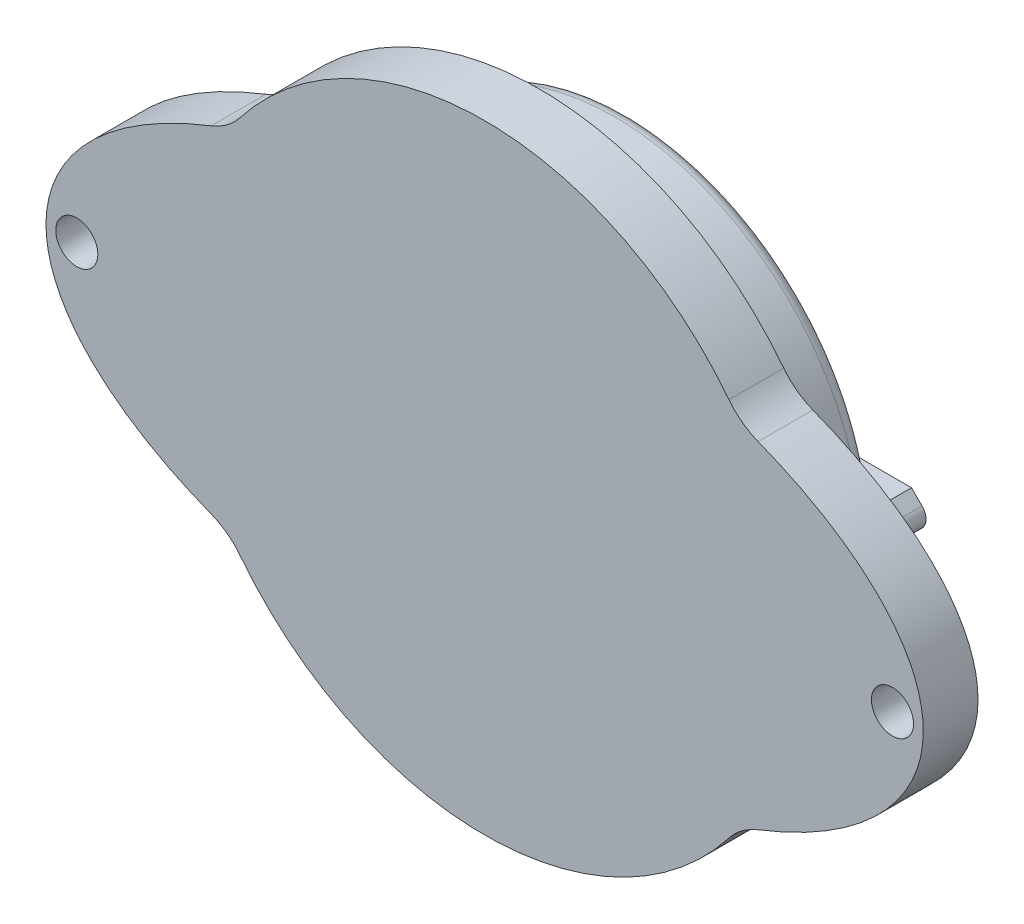
ISO-10303-21;
HEADER;
FILE_DESCRIPTION(('STEP AP214'),'2;1');
FILE_NAME('part.step','',(''),(''),'','','');
FILE_SCHEMA(('AUTOMOTIVE_DESIGN { 1 0 10303 214 1 1 1 1 }'));
ENDSEC;
DATA;
#1=APPLICATION_CONTEXT('core data for automotive mechanical design processes');
#2=APPLICATION_PROTOCOL_DEFINITION('international standard','automotive_design',2000,#1);
#3=PRODUCT_CONTEXT('',#1,'mechanical');
#4=PRODUCT('Part','Part','',(#3));
#5=PRODUCT_RELATED_PRODUCT_CATEGORY('part','',(#4));
#6=PRODUCT_DEFINITION_FORMATION('','',#4);
#7=PRODUCT_DEFINITION_CONTEXT('part definition',#1,'design');
#8=PRODUCT_DEFINITION('design','',#6,#7);
#9=PRODUCT_DEFINITION_SHAPE('','',#8);
#10=(LENGTH_UNIT() NAMED_UNIT(*) SI_UNIT(.MILLI.,.METRE.));
#11=(NAMED_UNIT(*) PLANE_ANGLE_UNIT() SI_UNIT($,.RADIAN.));
#12=(NAMED_UNIT(*) SI_UNIT($,.STERADIAN.) SOLID_ANGLE_UNIT());
#13=UNCERTAINTY_MEASURE_WITH_UNIT(LENGTH_MEASURE(1.E-05),#10,'distance_accuracy_value','');
#14=(GEOMETRIC_REPRESENTATION_CONTEXT(3) GLOBAL_UNCERTAINTY_ASSIGNED_CONTEXT((#13)) GLOBAL_UNIT_ASSIGNED_CONTEXT((#10,
#11,#12)) REPRESENTATION_CONTEXT('',''));
#15=CARTESIAN_POINT('',(0.,0.,0.));
#16=DIRECTION('',(0.,0.,1.));
#17=DIRECTION('',(1.,0.,0.));
#18=AXIS2_PLACEMENT_3D('',#15,#16,#17);
#19=CARTESIAN_POINT('',(0.,0.,-1.625));
#20=DIRECTION('',(0.,0.,-1.));
#21=DIRECTION('',(-1.,0.,0.));
#22=AXIS2_PLACEMENT_3D('',#19,#20,#21);
#23=PLANE('',#22);
#24=CARTESIAN_POINT('',(0.,0.,-1.625));
#25=DIRECTION('',(0.,0.,-1.));
#26=DIRECTION('',(-1.,0.,0.));
#27=AXIS2_PLACEMENT_3D('',#24,#25,#26);
#28=CIRCLE('',#27,1.07162769978083);
#29=CARTESIAN_POINT('',(1.00641753448666,-0.368116385420897,-1.625));
#30=VERTEX_POINT('',#29);
#31=CARTESIAN_POINT('',(-1.00641753448666,-0.368116385420897,-1.625));
#32=VERTEX_POINT('',#31);
#33=EDGE_CURVE('E58',#30,#32,#28,.T.);
#34=ORIENTED_EDGE('',*,*,#33,.F.);
#35=DIRECTION('',(-1.,0.,0.));
#36=VECTOR('',#35,1.);
#37=CARTESIAN_POINT('',(0.,-0.368116385420897,-1.625));
#38=LINE('',#37,#36);
#39=CARTESIAN_POINT('',(4.26000310000235,-0.368116385420897,-1.625));
#40=VERTEX_POINT('',#39);
#41=EDGE_CURVE('E349',#40,#30,#38,.T.);
#42=ORIENTED_EDGE('',*,*,#41,.F.);
#43=CARTESIAN_POINT('',(0.,0.,-1.625));
#44=DIRECTION('',(0.,0.,-1.));
#45=DIRECTION('',(-1.,0.,0.));
#46=AXIS2_PLACEMENT_3D('',#43,#44,#45);
#47=CIRCLE('',#46,4.27587839925845);
#48=CARTESIAN_POINT('',(-4.26000310000235,-0.368116385420897,-1.625));
#49=VERTEX_POINT('',#48);
#50=EDGE_CURVE('E343',#40,#49,#47,.T.);
#51=ORIENTED_EDGE('',*,*,#50,.T.);
#52=DIRECTION('',(-1.,0.,0.));
#53=VECTOR('',#52,1.);
#54=CARTESIAN_POINT('',(0.,-0.368116385420897,-1.625));
#55=LINE('',#54,#53);
#56=EDGE_CURVE('E63',#32,#49,#55,.T.);
#57=ORIENTED_EDGE('',*,*,#56,.F.);
#58=EDGE_LOOP('',(#34,#42,#51,#57));
#59=FACE_BOUND('',#58,.T.);
#60=ADVANCED_FACE('F43',(#59),#23,.T.);
#61=CARTESIAN_POINT('',(0.,0.,1.));
#62=DIRECTION('',(0.,0.,1.));
#63=DIRECTION('',(1.,0.,0.));
#64=AXIS2_PLACEMENT_3D('',#61,#62,#63);
#65=PLANE('',#64);
#66=CARTESIAN_POINT('',(-7.45231171374297,0.,1.));
#67=DIRECTION('',(0.,0.,1.));
#68=DIRECTION('',(1.,0.,0.));
#69=AXIS2_PLACEMENT_3D('',#66,#67,#68);
#70=CIRCLE('',#69,0.384477113661822);
#71=CARTESIAN_POINT('',(-7.06783460008115,0.,1.));
#72=VERTEX_POINT('',#71);
#73=EDGE_CURVE('E252',#72,#72,#70,.T.);
#74=ORIENTED_EDGE('',*,*,#73,.F.);
#75=EDGE_LOOP('',(#74));
#76=FACE_BOUND('',#75,.T.);
#77=CARTESIAN_POINT('',(0.,0.,1.));
#78=DIRECTION('',(0.,0.,1.));
#79=DIRECTION('',(1.,0.,0.));
#80=AXIS2_PLACEMENT_3D('',#77,#78,#79);
#81=ELLIPSE('',#80,8.01519842061445,3.92812840443711);
#82=CARTESIAN_POINT('',(4.99680595867471,-3.07136444133974,1.));
#83=VERTEX_POINT('',#82);
#84=CARTESIAN_POINT('',(4.99680595867472,3.07136444133974,1.));
#85=VERTEX_POINT('',#84);
#86=EDGE_CURVE('E258',#83,#85,#81,.T.);
#87=ORIENTED_EDGE('',*,*,#86,.T.);
#88=CARTESIAN_POINT('',(5.45174987300439,4.23563504339683,1.));
#89=DIRECTION('',(0.,0.,-1.));
#90=DIRECTION('',(-1.,0.,0.));
#91=AXIS2_PLACEMENT_3D('',#88,#89,#90);
#92=CIRCLE('',#91,1.25);
#93=CARTESIAN_POINT('',(4.46465480991579,3.46873000597295,1.));
#94=VERTEX_POINT('',#93);
#95=EDGE_CURVE('E262',#85,#94,#92,.T.);
#96=ORIENTED_EDGE('',*,*,#95,.T.);
#97=CARTESIAN_POINT('',(0.,0.,1.));
#98=DIRECTION('',(0.,0.,1.));
#99=DIRECTION('',(1.,0.,0.));
#100=AXIS2_PLACEMENT_3D('',#97,#98,#99);
#101=CIRCLE('',#100,5.65378018904532);
#102=CARTESIAN_POINT('',(-4.46465480991579,3.46873000597296,1.));
#103=VERTEX_POINT('',#102);
#104=EDGE_CURVE('E862',#94,#103,#101,.T.);
#105=ORIENTED_EDGE('',*,*,#104,.T.);
#106=CARTESIAN_POINT('',(-5.45174987300439,4.23563504339683,1.));
#107=DIRECTION('',(0.,0.,-1.));
#108=DIRECTION('',(-1.,0.,0.));
#109=AXIS2_PLACEMENT_3D('',#106,#107,#108);
#110=CIRCLE('',#109,1.25);
#111=CARTESIAN_POINT('',(-4.99680595867472,3.07136444133973,1.));
#112=VERTEX_POINT('',#111);
#113=EDGE_CURVE('E294',#103,#112,#110,.T.);
#114=ORIENTED_EDGE('',*,*,#113,.T.);
#115=CARTESIAN_POINT('',(0.,0.,1.));
#116=DIRECTION('',(0.,0.,1.));
#117=DIRECTION('',(1.,0.,0.));
#118=AXIS2_PLACEMENT_3D('',#115,#116,#117);
#119=ELLIPSE('',#118,8.01519842061445,3.92812840443711);
#120=CARTESIAN_POINT('',(-4.99680595867471,-3.07136444133974,1.));
#121=VERTEX_POINT('',#120);
#122=EDGE_CURVE('E289',#112,#121,#119,.T.);
#123=ORIENTED_EDGE('',*,*,#122,.T.);
#124=CARTESIAN_POINT('',(-5.45174987300439,-4.23563504339683,1.));
#125=DIRECTION('',(0.,0.,-1.));
#126=DIRECTION('',(1.,0.,0.));
#127=AXIS2_PLACEMENT_3D('',#124,#125,#126);
#128=CIRCLE('',#127,1.25);
#129=CARTESIAN_POINT('',(-4.46465480991579,-3.46873000597295,1.));
#130=VERTEX_POINT('',#129);
#131=EDGE_CURVE('E293',#121,#130,#128,.T.);
#132=ORIENTED_EDGE('',*,*,#131,.T.);
#133=CARTESIAN_POINT('',(0.,0.,1.));
#134=DIRECTION('',(0.,0.,1.));
#135=DIRECTION('',(1.,0.,0.));
#136=AXIS2_PLACEMENT_3D('',#133,#134,#135);
#137=CIRCLE('',#136,5.65378018904532);
#138=CARTESIAN_POINT('',(4.46465480991579,-3.46873000597296,1.));
#139=VERTEX_POINT('',#138);
#140=EDGE_CURVE('E296',#130,#139,#137,.T.);
#141=ORIENTED_EDGE('',*,*,#140,.T.);
#142=CARTESIAN_POINT('',(5.45174987300439,-4.23563504339683,1.));
#143=DIRECTION('',(0.,0.,-1.));
#144=DIRECTION('',(1.,0.,0.));
#145=AXIS2_PLACEMENT_3D('',#142,#143,#144);
#146=CIRCLE('',#145,1.25);
#147=EDGE_CURVE('E298',#139,#83,#146,.T.);
#148=ORIENTED_EDGE('',*,*,#147,.T.);
#149=EDGE_LOOP('',(#87,#96,#105,#114,#123,#132,#141,#148));
#150=FACE_BOUND('',#149,.T.);
#151=CARTESIAN_POINT('',(7.45231171374297,0.0245410923613923,1.));
#152=DIRECTION('',(0.,0.,1.));
#153=DIRECTION('',(1.,0.,0.));
#154=AXIS2_PLACEMENT_3D('',#151,#152,#153);
#155=CIRCLE('',#154,0.38447711366182);
#156=CARTESIAN_POINT('',(7.83678882740479,0.0245410923613923,1.));
#157=VERTEX_POINT('',#156);
#158=EDGE_CURVE('E246',#157,#157,#155,.T.);
#159=ORIENTED_EDGE('',*,*,#158,.F.);
#160=EDGE_LOOP('',(#159));
#161=FACE_BOUND('',#160,.T.);
#162=ADVANCED_FACE('F443',(#76,#150,#161),#65,.T.);
#163=CARTESIAN_POINT('',(0.,0.,0.));
#164=DIRECTION('',(0.,0.,1.));
#165=DIRECTION('',(1.,0.,0.));
#166=AXIS2_PLACEMENT_3D('',#163,#164,#165);
#167=PLANE('',#166);
#168=CARTESIAN_POINT('',(0.,0.,0.));
#169=DIRECTION('',(0.,0.,-1.));
#170=DIRECTION('',(-1.,0.,0.));
#171=AXIS2_PLACEMENT_3D('',#168,#169,#170);
#172=CIRCLE('',#171,5.17450547365865);
#173=CARTESIAN_POINT('',(-5.17450547365865,0.,0.));
#174=VERTEX_POINT('',#173);
#175=EDGE_CURVE('E237',#174,#174,#172,.T.);
#176=ORIENTED_EDGE('',*,*,#175,.F.);
#177=EDGE_LOOP('',(#176));
#178=FACE_BOUND('',#177,.T.);
#179=CARTESIAN_POINT('',(0.,0.,0.));
#180=DIRECTION('',(0.,0.,1.));
#181=DIRECTION('',(1.,0.,0.));
#182=AXIS2_PLACEMENT_3D('',#179,#180,#181);
#183=ELLIPSE('',#182,8.01519842061445,3.92812840443711);
#184=CARTESIAN_POINT('',(4.99680595867471,-3.07136444133974,0.));
#185=VERTEX_POINT('',#184);
#186=CARTESIAN_POINT('',(4.99680595867472,3.07136444133974,0.));
#187=VERTEX_POINT('',#186);
#188=EDGE_CURVE('E255',#185,#187,#183,.T.);
#189=ORIENTED_EDGE('',*,*,#188,.F.);
#190=CARTESIAN_POINT('',(5.45174987300439,-4.23563504339683,0.));
#191=DIRECTION('',(0.,0.,-1.));
#192=DIRECTION('',(1.,0.,0.));
#193=AXIS2_PLACEMENT_3D('',#190,#191,#192);
#194=CIRCLE('',#193,1.25);
#195=CARTESIAN_POINT('',(4.46465480991579,-3.46873000597296,0.));
#196=VERTEX_POINT('',#195);
#197=EDGE_CURVE('E263',#196,#185,#194,.T.);
#198=ORIENTED_EDGE('',*,*,#197,.F.);
#199=CARTESIAN_POINT('',(0.,0.,0.));
#200=DIRECTION('',(0.,0.,1.));
#201=DIRECTION('',(1.,0.,0.));
#202=AXIS2_PLACEMENT_3D('',#199,#200,#201);
#203=CIRCLE('',#202,5.65378018904532);
#204=CARTESIAN_POINT('',(-4.46465480991579,-3.46873000597295,0.));
#205=VERTEX_POINT('',#204);
#206=EDGE_CURVE('E313',#205,#196,#203,.T.);
#207=ORIENTED_EDGE('',*,*,#206,.F.);
#208=CARTESIAN_POINT('',(-5.45174987300439,-4.23563504339683,0.));
#209=DIRECTION('',(0.,0.,-1.));
#210=DIRECTION('',(1.,0.,0.));
#211=AXIS2_PLACEMENT_3D('',#208,#209,#210);
#212=CIRCLE('',#211,1.25);
#213=CARTESIAN_POINT('',(-4.99680595867471,-3.07136444133974,0.));
#214=VERTEX_POINT('',#213);
#215=EDGE_CURVE('E311',#214,#205,#212,.T.);
#216=ORIENTED_EDGE('',*,*,#215,.F.);
#217=CARTESIAN_POINT('',(0.,0.,0.));
#218=DIRECTION('',(0.,0.,1.));
#219=DIRECTION('',(1.,0.,0.));
#220=AXIS2_PLACEMENT_3D('',#217,#218,#219);
#221=ELLIPSE('',#220,8.01519842061445,3.92812840443711);
#222=CARTESIAN_POINT('',(-4.99680595867472,3.07136444133973,0.));
#223=VERTEX_POINT('',#222);
#224=EDGE_CURVE('E309',#223,#214,#221,.T.);
#225=ORIENTED_EDGE('',*,*,#224,.F.);
#226=CARTESIAN_POINT('',(-5.45174987300439,4.23563504339683,0.));
#227=DIRECTION('',(0.,0.,-1.));
#228=DIRECTION('',(-1.,0.,0.));
#229=AXIS2_PLACEMENT_3D('',#226,#227,#228);
#230=CIRCLE('',#229,1.25);
#231=CARTESIAN_POINT('',(-4.46465480991579,3.46873000597296,0.));
#232=VERTEX_POINT('',#231);
#233=EDGE_CURVE('E307',#232,#223,#230,.T.);
#234=ORIENTED_EDGE('',*,*,#233,.F.);
#235=CARTESIAN_POINT('',(0.,0.,0.));
#236=DIRECTION('',(0.,0.,1.));
#237=DIRECTION('',(1.,0.,0.));
#238=AXIS2_PLACEMENT_3D('',#235,#236,#237);
#239=CIRCLE('',#238,5.65378018904532);
#240=CARTESIAN_POINT('',(4.46465480991579,3.46873000597295,0.));
#241=VERTEX_POINT('',#240);
#242=EDGE_CURVE('E305',#241,#232,#239,.T.);
#243=ORIENTED_EDGE('',*,*,#242,.F.);
#244=CARTESIAN_POINT('',(5.45174987300439,4.23563504339683,0.));
#245=DIRECTION('',(0.,0.,-1.));
#246=DIRECTION('',(-1.,0.,0.));
#247=AXIS2_PLACEMENT_3D('',#244,#245,#246);
#248=CIRCLE('',#247,1.25);
#249=EDGE_CURVE('E303',#187,#241,#248,.T.);
#250=ORIENTED_EDGE('',*,*,#249,.F.);
#251=EDGE_LOOP('',(#189,#198,#207,#216,#225,#234,#243,#250));
#252=FACE_BOUND('',#251,.T.);
#253=CARTESIAN_POINT('',(-7.45231171374297,0.,0.));
#254=DIRECTION('',(0.,0.,1.));
#255=DIRECTION('',(1.,0.,0.));
#256=AXIS2_PLACEMENT_3D('',#253,#254,#255);
#257=CIRCLE('',#256,0.384477113661822);
#258=CARTESIAN_POINT('',(-7.06783460008115,0.,0.));
#259=VERTEX_POINT('',#258);
#260=EDGE_CURVE('E249',#259,#259,#257,.T.);
#261=ORIENTED_EDGE('',*,*,#260,.T.);
#262=EDGE_LOOP('',(#261));
#263=FACE_BOUND('',#262,.T.);
#264=CARTESIAN_POINT('',(7.45231171374297,0.0245410923613923,0.));
#265=DIRECTION('',(0.,0.,1.));
#266=DIRECTION('',(1.,0.,0.));
#267=AXIS2_PLACEMENT_3D('',#264,#265,#266);
#268=CIRCLE('',#267,0.38447711366182);
#269=CARTESIAN_POINT('',(7.83678882740479,0.0245410923613923,0.));
#270=VERTEX_POINT('',#269);
#271=EDGE_CURVE('E243',#270,#270,#268,.T.);
#272=ORIENTED_EDGE('',*,*,#271,.T.);
#273=EDGE_LOOP('',(#272));
#274=FACE_BOUND('',#273,.T.);
#275=ADVANCED_FACE('F269',(#178,#252,#263,#274),#167,.F.);
#276=DIRECTION('',(0.,0.,-1.));
#277=VECTOR('',#276,1.);
#278=SURFACE_OF_LINEAR_EXTRUSION('',#81,#277);
#279=ORIENTED_EDGE('',*,*,#188,.T.);
#280=DIRECTION('',(0.,0.,-1.));
#281=VECTOR('',#280,1.);
#282=CARTESIAN_POINT('',(4.99680595867472,3.07136444133974,1.));
#283=LINE('',#282,#281);
#284=EDGE_CURVE('E233',#85,#187,#283,.T.);
#285=ORIENTED_EDGE('',*,*,#284,.F.);
#286=ORIENTED_EDGE('',*,*,#86,.F.);
#287=DIRECTION('',(0.,0.,-1.));
#288=VECTOR('',#287,1.);
#289=CARTESIAN_POINT('',(4.99680595867471,-3.07136444133974,1.));
#290=LINE('',#289,#288);
#291=EDGE_CURVE('E300',#83,#185,#290,.T.);
#292=ORIENTED_EDGE('',*,*,#291,.T.);
#293=EDGE_LOOP('',(#279,#285,#286,#292));
#294=FACE_BOUND('',#293,.T.);
#295=ADVANCED_FACE('F265',(#294),#278,.F.);
#296=CARTESIAN_POINT('',(5.45174987300439,4.23563504339683,1.));
#297=DIRECTION('',(0.,0.,-1.));
#298=DIRECTION('',(-1.,0.,0.));
#299=AXIS2_PLACEMENT_3D('',#296,#297,#298);
#300=CYLINDRICAL_SURFACE('',#299,1.25);
#301=ORIENTED_EDGE('',*,*,#249,.T.);
#302=DIRECTION('',(0.,0.,-1.));
#303=VECTOR('',#302,1.);
#304=CARTESIAN_POINT('',(4.46465480991579,3.46873000597295,1.));
#305=LINE('',#304,#303);
#306=EDGE_CURVE('E333',#94,#241,#305,.T.);
#307=ORIENTED_EDGE('',*,*,#306,.F.);
#308=ORIENTED_EDGE('',*,*,#95,.F.);
#309=ORIENTED_EDGE('',*,*,#284,.T.);
#310=EDGE_LOOP('',(#301,#307,#308,#309));
#311=FACE_BOUND('',#310,.T.);
#312=ADVANCED_FACE('F268',(#311),#300,.F.);
#313=CARTESIAN_POINT('',(0.,0.,1.));
#314=DIRECTION('',(0.,0.,-1.));
#315=DIRECTION('',(-1.,0.,0.));
#316=AXIS2_PLACEMENT_3D('',#313,#314,#315);
#317=CYLINDRICAL_SURFACE('',#316,5.65378018904532);
#318=ORIENTED_EDGE('',*,*,#242,.T.);
#319=DIRECTION('',(0.,0.,-1.));
#320=VECTOR('',#319,1.);
#321=CARTESIAN_POINT('',(-4.46465480991579,3.46873000597296,1.));
#322=LINE('',#321,#320);
#323=EDGE_CURVE('E330',#103,#232,#322,.T.);
#324=ORIENTED_EDGE('',*,*,#323,.F.);
#325=ORIENTED_EDGE('',*,*,#104,.F.);
#326=ORIENTED_EDGE('',*,*,#306,.T.);
#327=EDGE_LOOP('',(#318,#324,#325,#326));
#328=FACE_BOUND('',#327,.T.);
#329=ADVANCED_FACE('F273',(#328),#317,.T.);
#330=CARTESIAN_POINT('',(-5.45174987300439,4.23563504339683,1.));
#331=DIRECTION('',(0.,0.,-1.));
#332=DIRECTION('',(-1.,0.,0.));
#333=AXIS2_PLACEMENT_3D('',#330,#331,#332);
#334=CYLINDRICAL_SURFACE('',#333,1.25);
#335=ORIENTED_EDGE('',*,*,#233,.T.);
#336=DIRECTION('',(0.,0.,-1.));
#337=VECTOR('',#336,1.);
#338=CARTESIAN_POINT('',(-4.99680595867472,3.07136444133973,1.));
#339=LINE('',#338,#337);
#340=EDGE_CURVE('E327',#112,#223,#339,.T.);
#341=ORIENTED_EDGE('',*,*,#340,.F.);
#342=ORIENTED_EDGE('',*,*,#113,.F.);
#343=ORIENTED_EDGE('',*,*,#323,.T.);
#344=EDGE_LOOP('',(#335,#341,#342,#343));
#345=FACE_BOUND('',#344,.T.);
#346=ADVANCED_FACE('F277',(#345),#334,.F.);
#347=DIRECTION('',(0.,0.,-1.));
#348=VECTOR('',#347,1.);
#349=SURFACE_OF_LINEAR_EXTRUSION('',#119,#348);
#350=ORIENTED_EDGE('',*,*,#224,.T.);
#351=DIRECTION('',(0.,0.,-1.));
#352=VECTOR('',#351,1.);
#353=CARTESIAN_POINT('',(-4.99680595867471,-3.07136444133974,1.));
#354=LINE('',#353,#352);
#355=EDGE_CURVE('E324',#121,#214,#354,.T.);
#356=ORIENTED_EDGE('',*,*,#355,.F.);
#357=ORIENTED_EDGE('',*,*,#122,.F.);
#358=ORIENTED_EDGE('',*,*,#340,.T.);
#359=EDGE_LOOP('',(#350,#356,#357,#358));
#360=FACE_BOUND('',#359,.T.);
#361=ADVANCED_FACE('F281',(#360),#349,.F.);
#362=CARTESIAN_POINT('',(-5.45174987300439,-4.23563504339683,1.));
#363=DIRECTION('',(0.,0.,-1.));
#364=DIRECTION('',(-1.,0.,0.));
#365=AXIS2_PLACEMENT_3D('',#362,#363,#364);
#366=CYLINDRICAL_SURFACE('',#365,1.25);
#367=ORIENTED_EDGE('',*,*,#215,.T.);
#368=DIRECTION('',(0.,0.,-1.));
#369=VECTOR('',#368,1.);
#370=CARTESIAN_POINT('',(-4.46465480991579,-3.46873000597295,1.));
#371=LINE('',#370,#369);
#372=EDGE_CURVE('E321',#130,#205,#371,.T.);
#373=ORIENTED_EDGE('',*,*,#372,.F.);
#374=ORIENTED_EDGE('',*,*,#131,.F.);
#375=ORIENTED_EDGE('',*,*,#355,.T.);
#376=EDGE_LOOP('',(#367,#373,#374,#375));
#377=FACE_BOUND('',#376,.T.);
#378=ADVANCED_FACE('F286',(#377),#366,.F.);
#379=CARTESIAN_POINT('',(0.,0.,1.));
#380=DIRECTION('',(0.,0.,-1.));
#381=DIRECTION('',(-1.,0.,0.));
#382=AXIS2_PLACEMENT_3D('',#379,#380,#381);
#383=CYLINDRICAL_SURFACE('',#382,5.65378018904532);
#384=ORIENTED_EDGE('',*,*,#206,.T.);
#385=DIRECTION('',(0.,0.,-1.));
#386=VECTOR('',#385,1.);
#387=CARTESIAN_POINT('',(4.46465480991579,-3.46873000597296,1.));
#388=LINE('',#387,#386);
#389=EDGE_CURVE('E318',#139,#196,#388,.T.);
#390=ORIENTED_EDGE('',*,*,#389,.F.);
#391=ORIENTED_EDGE('',*,*,#140,.F.);
#392=ORIENTED_EDGE('',*,*,#372,.T.);
#393=EDGE_LOOP('',(#384,#390,#391,#392));
#394=FACE_BOUND('',#393,.T.);
#395=ADVANCED_FACE('F692',(#394),#383,.T.);
#396=CARTESIAN_POINT('',(5.45174987300439,-4.23563504339683,1.));
#397=DIRECTION('',(0.,0.,-1.));
#398=DIRECTION('',(-1.,0.,0.));
#399=AXIS2_PLACEMENT_3D('',#396,#397,#398);
#400=CYLINDRICAL_SURFACE('',#399,1.25);
#401=ORIENTED_EDGE('',*,*,#197,.T.);
#402=ORIENTED_EDGE('',*,*,#291,.F.);
#403=ORIENTED_EDGE('',*,*,#147,.F.);
#404=ORIENTED_EDGE('',*,*,#389,.T.);
#405=EDGE_LOOP('',(#401,#402,#403,#404));
#406=FACE_BOUND('',#405,.T.);
#407=ADVANCED_FACE('F687',(#406),#400,.F.);
#408=CARTESIAN_POINT('',(-7.45231171374297,0.,1.));
#409=DIRECTION('',(0.,0.,-1.));
#410=DIRECTION('',(-1.,0.,0.));
#411=AXIS2_PLACEMENT_3D('',#408,#409,#410);
#412=CYLINDRICAL_SURFACE('',#411,0.384477113661822);
#413=ORIENTED_EDGE('',*,*,#73,.T.);
#414=EDGE_LOOP('',(#413));
#415=FACE_BOUND('',#414,.T.);
#416=ORIENTED_EDGE('',*,*,#260,.F.);
#417=EDGE_LOOP('',(#416));
#418=FACE_BOUND('',#417,.T.);
#419=ADVANCED_FACE('F691',(#415,#418),#412,.F.);
#420=CARTESIAN_POINT('',(7.45231171374297,0.0245410923613923,1.));
#421=DIRECTION('',(0.,0.,-1.));
#422=DIRECTION('',(-1.,0.,0.));
#423=AXIS2_PLACEMENT_3D('',#420,#421,#422);
#424=CYLINDRICAL_SURFACE('',#423,0.38447711366182);
#425=ORIENTED_EDGE('',*,*,#158,.T.);
#426=EDGE_LOOP('',(#425));
#427=FACE_BOUND('',#426,.T.);
#428=ORIENTED_EDGE('',*,*,#271,.F.);
#429=EDGE_LOOP('',(#428));
#430=FACE_BOUND('',#429,.T.);
#431=ADVANCED_FACE('F717',(#427,#430),#424,.F.);
#432=CARTESIAN_POINT('',(0.,0.,0.25));
#433=DIRECTION('',(0.,0.,-1.));
#434=DIRECTION('',(-1.,0.,0.));
#435=AXIS2_PLACEMENT_3D('',#432,#433,#434);
#436=CYLINDRICAL_SURFACE('',#435,5.17450547365865);
#437=CARTESIAN_POINT('',(0.,0.,0.25));
#438=DIRECTION('',(0.,0.,-1.));
#439=DIRECTION('',(-1.,0.,0.));
#440=AXIS2_PLACEMENT_3D('',#437,#438,#439);
#441=CIRCLE('',#440,5.17450547365865);
#442=CARTESIAN_POINT('',(-5.17450547365865,0.,0.25));
#443=VERTEX_POINT('',#442);
#444=EDGE_CURVE('E240',#443,#443,#441,.T.);
#445=ORIENTED_EDGE('',*,*,#444,.F.);
#446=EDGE_LOOP('',(#445));
#447=FACE_BOUND('',#446,.T.);
#448=ORIENTED_EDGE('',*,*,#175,.T.);
#449=EDGE_LOOP('',(#448));
#450=FACE_BOUND('',#449,.T.);
#451=ADVANCED_FACE('F721',(#447,#450),#436,.F.);
#452=CARTESIAN_POINT('',(0.,0.,0.25));
#453=DIRECTION('',(0.,0.,-1.));
#454=DIRECTION('',(-1.,0.,0.));
#455=AXIS2_PLACEMENT_3D('',#452,#453,#454);
#456=PLANE('',#455);
#457=CARTESIAN_POINT('',(0.,0.,0.25));
#458=DIRECTION('',(0.,0.,-1.));
#459=DIRECTION('',(-1.,0.,0.));
#460=AXIS2_PLACEMENT_3D('',#457,#458,#459);
#461=CIRCLE('',#460,5.025);
#462=CARTESIAN_POINT('',(-5.025,0.,0.25));
#463=VERTEX_POINT('',#462);
#464=EDGE_CURVE('E234',#463,#463,#461,.T.);
#465=ORIENTED_EDGE('',*,*,#464,.F.);
#466=EDGE_LOOP('',(#465));
#467=FACE_BOUND('',#466,.T.);
#468=ORIENTED_EDGE('',*,*,#444,.T.);
#469=EDGE_LOOP('',(#468));
#470=FACE_BOUND('',#469,.T.);
#471=ADVANCED_FACE('F736',(#467,#470),#456,.T.);
#472=CARTESIAN_POINT('',(0.,0.,0.25));
#473=DIRECTION('',(0.,0.,-1.));
#474=DIRECTION('',(-1.,0.,0.));
#475=AXIS2_PLACEMENT_3D('',#472,#473,#474);
#476=CYLINDRICAL_SURFACE('',#475,5.025);
#477=ORIENTED_EDGE('',*,*,#464,.T.);
#478=EDGE_LOOP('',(#477));
#479=FACE_BOUND('',#478,.T.);
#480=CARTESIAN_POINT('',(0.,0.,0.));
#481=DIRECTION('',(0.,0.,-1.));
#482=DIRECTION('',(-1.,0.,0.));
#483=AXIS2_PLACEMENT_3D('',#480,#481,#482);
#484=CIRCLE('',#483,5.025);
#485=CARTESIAN_POINT('',(-5.025,0.,0.));
#486=VERTEX_POINT('',#485);
#487=EDGE_CURVE('E228',#486,#486,#484,.T.);
#488=ORIENTED_EDGE('',*,*,#487,.F.);
#489=EDGE_LOOP('',(#488));
#490=FACE_BOUND('',#489,.T.);
#491=ADVANCED_FACE('F732',(#479,#490),#476,.T.);
#492=CARTESIAN_POINT('',(0.,0.,0.));
#493=DIRECTION('',(0.,0.,-1.));
#494=DIRECTION('',(-1.,0.,0.));
#495=AXIS2_PLACEMENT_3D('',#492,#493,#494);
#496=CIRCLE('',#495,3.23124382758339);
#497=CARTESIAN_POINT('',(-3.23124382758339,0.,0.));
#498=VERTEX_POINT('',#497);
#499=EDGE_CURVE('E229',#498,#498,#496,.T.);
#500=ORIENTED_EDGE('',*,*,#499,.F.);
#501=EDGE_LOOP('',(#500));
#502=FACE_BOUND('',#501,.T.);
#503=ORIENTED_EDGE('',*,*,#487,.T.);
#504=EDGE_LOOP('',(#503));
#505=FACE_BOUND('',#504,.T.);
#506=ADVANCED_FACE('F679',(#502,#505),#167,.F.);
#507=CARTESIAN_POINT('',(0.,0.,-0.125));
#508=DIRECTION('',(0.,0.,1.));
#509=DIRECTION('',(1.,0.,0.));
#510=AXIS2_PLACEMENT_3D('',#507,#508,#509);
#511=CYLINDRICAL_SURFACE('',#510,3.23124382758339);
#512=CARTESIAN_POINT('',(0.,0.,-0.125));
#513=DIRECTION('',(0.,0.,-1.));
#514=DIRECTION('',(-1.,0.,0.));
#515=AXIS2_PLACEMENT_3D('',#512,#513,#514);
#516=CIRCLE('',#515,3.23124382758339);
#517=CARTESIAN_POINT('',(-3.23124382758339,0.,-0.125));
#518=VERTEX_POINT('',#517);
#519=EDGE_CURVE('E220',#518,#518,#516,.T.);
#520=ORIENTED_EDGE('',*,*,#519,.F.);
#521=EDGE_LOOP('',(#520));
#522=FACE_BOUND('',#521,.T.);
#523=ORIENTED_EDGE('',*,*,#499,.T.);
#524=EDGE_LOOP('',(#523));
#525=FACE_BOUND('',#524,.T.);
#526=ADVANCED_FACE('F462',(#522,#525),#511,.T.);
#527=CARTESIAN_POINT('',(0.,0.,-1.625));
#528=DIRECTION('',(0.,0.,1.));
#529=DIRECTION('',(1.,0.,0.));
#530=AXIS2_PLACEMENT_3D('',#527,#528,#529);
#531=CYLINDRICAL_SURFACE('',#530,4.52587839925845);
#532=CARTESIAN_POINT('',(0.,0.,-1.375));
#533=DIRECTION('',(0.,0.,-1.));
#534=DIRECTION('',(-1.,0.,0.));
#535=AXIS2_PLACEMENT_3D('',#532,#533,#534);
#536=CIRCLE('',#535,4.52587839925845);
#537=CARTESIAN_POINT('',(-4.52587839925845,0.,-1.375));
#538=VERTEX_POINT('',#537);
#539=EDGE_CURVE('E11',#538,#538,#536,.F.);
#540=ORIENTED_EDGE('',*,*,#539,.T.);
#541=EDGE_LOOP('',(#540));
#542=FACE_BOUND('',#541,.T.);
#543=CARTESIAN_POINT('',(0.,0.,-0.125));
#544=DIRECTION('',(0.,0.,-1.));
#545=DIRECTION('',(-1.,0.,0.));
#546=AXIS2_PLACEMENT_3D('',#543,#544,#545);
#547=CIRCLE('',#546,4.52587839925845);
#548=CARTESIAN_POINT('',(-4.52587839925845,0.,-0.125));
#549=VERTEX_POINT('',#548);
#550=EDGE_CURVE('E217',#549,#549,#547,.T.);
#551=ORIENTED_EDGE('',*,*,#550,.T.);
#552=EDGE_LOOP('',(#551));
#553=FACE_BOUND('',#552,.T.);
#554=ADVANCED_FACE('F456',(#542,#553),#531,.T.);
#555=DIRECTION('',(-1.,0.,0.));
#556=VECTOR('',#555,1.);
#557=CARTESIAN_POINT('',(0.,0.368116385420897,-1.625));
#558=LINE('',#557,#556);
#559=CARTESIAN_POINT('',(-1.00641753448666,0.368116385420897,-1.625));
#560=VERTEX_POINT('',#559);
#561=CARTESIAN_POINT('',(-4.26000310000235,0.368116385420897,-1.625));
#562=VERTEX_POINT('',#561);
#563=EDGE_CURVE('E376',#560,#562,#558,.T.);
#564=ORIENTED_EDGE('',*,*,#563,.T.);
#565=CARTESIAN_POINT('',(4.26000310000235,0.368116385420897,-1.625));
#566=VERTEX_POINT('',#565);
#567=EDGE_CURVE('E51',#562,#566,#47,.T.);
#568=ORIENTED_EDGE('',*,*,#567,.T.);
#569=CARTESIAN_POINT('',(1.00641753448666,0.368116385420897,-1.625));
#570=VERTEX_POINT('',#569);
#571=EDGE_CURVE('E382',#566,#570,#558,.T.);
#572=ORIENTED_EDGE('',*,*,#571,.T.);
#573=CARTESIAN_POINT('',(0.,0.,-1.625));
#574=DIRECTION('',(0.,0.,-1.));
#575=DIRECTION('',(-1.,0.,0.));
#576=AXIS2_PLACEMENT_3D('',#573,#574,#575);
#577=CIRCLE('',#576,1.07162769978083);
#578=EDGE_CURVE('E378',#560,#570,#577,.T.);
#579=ORIENTED_EDGE('',*,*,#578,.F.);
#580=EDGE_LOOP('',(#564,#568,#572,#579));
#581=FACE_BOUND('',#580,.T.);
#582=ADVANCED_FACE('F445',(#581),#23,.T.);
#583=CARTESIAN_POINT('',(0.,0.,-0.125));
#584=DIRECTION('',(0.,0.,-1.));
#585=DIRECTION('',(-1.,0.,0.));
#586=AXIS2_PLACEMENT_3D('',#583,#584,#585);
#587=PLANE('',#586);
#588=ORIENTED_EDGE('',*,*,#519,.T.);
#589=EDGE_LOOP('',(#588));
#590=FACE_BOUND('',#589,.T.);
#591=ORIENTED_EDGE('',*,*,#550,.F.);
#592=EDGE_LOOP('',(#591));
#593=FACE_BOUND('',#592,.T.);
#594=ADVANCED_FACE('F455',(#590,#593),#587,.F.);
#595=CARTESIAN_POINT('',(0.,0.,-1.375));
#596=DIRECTION('',(0.,0.,-1.));
#597=DIRECTION('',(-1.,0.,0.));
#598=AXIS2_PLACEMENT_3D('',#595,#596,#597);
#599=TOROIDAL_SURFACE('',#598,4.27587839925845,0.25);
#600=ORIENTED_EDGE('',*,*,#539,.F.);
#601=EDGE_LOOP('',(#600));
#602=FACE_BOUND('',#601,.T.);
#603=ORIENTED_EDGE('',*,*,#567,.F.);
#604=EDGE_CURVE('E232',#49,#562,#47,.T.);
#605=ORIENTED_EDGE('',*,*,#604,.F.);
#606=ORIENTED_EDGE('',*,*,#50,.F.);
#607=EDGE_CURVE('E338',#566,#40,#47,.T.);
#608=ORIENTED_EDGE('',*,*,#607,.F.);
#609=EDGE_LOOP('',(#603,#605,#606,#608));
#610=FACE_BOUND('',#609,.T.);
#611=ADVANCED_FACE('F45',(#602,#610),#599,.T.);
#612=CARTESIAN_POINT('',(0.,0.,-1.625));
#613=DIRECTION('',(0.,0.,-1.));
#614=DIRECTION('',(-1.,0.,0.));
#615=AXIS2_PLACEMENT_3D('',#612,#613,#614);
#616=PLANE('',#615);
#617=ORIENTED_EDGE('',*,*,#607,.T.);
#618=CARTESIAN_POINT('',(4.42557698917118,-0.368116385420897,-1.625));
#619=VERTEX_POINT('',#618);
#620=EDGE_CURVE('E431',#619,#40,#38,.T.);
#621=ORIENTED_EDGE('',*,*,#620,.F.);
#622=DIRECTION('',(-0.707106781186548,-0.707106781186547,0.));
#623=VECTOR('',#622,1.);
#624=CARTESIAN_POINT('',(2.39684668729604,-2.39684668729604,-1.625));
#625=LINE('',#624,#623);
#626=CARTESIAN_POINT('',(4.61691667929544,-0.176776695296638,-1.625));
#627=VERTEX_POINT('',#626);
#628=EDGE_CURVE('E216',#627,#619,#625,.T.);
#629=ORIENTED_EDGE('',*,*,#628,.F.);
#630=CARTESIAN_POINT('',(4.4401399839988,0.,-1.625));
#631=DIRECTION('',(0.,0.,-1.));
#632=DIRECTION('',(-1.,0.,0.));
#633=AXIS2_PLACEMENT_3D('',#630,#631,#632);
#634=CIRCLE('',#633,0.25);
#635=CARTESIAN_POINT('',(4.61691667929544,0.176776695296638,-1.625));
#636=VERTEX_POINT('',#635);
#637=EDGE_CURVE('E212',#636,#627,#634,.T.);
#638=ORIENTED_EDGE('',*,*,#637,.F.);
#639=DIRECTION('',(0.707106781186548,-0.707106781186547,0.));
#640=VECTOR('',#639,1.);
#641=CARTESIAN_POINT('',(2.39684668729604,2.39684668729604,-1.625));
#642=LINE('',#641,#640);
#643=CARTESIAN_POINT('',(4.42557698917118,0.368116385420897,-1.625));
#644=VERTEX_POINT('',#643);
#645=EDGE_CURVE('E383',#644,#636,#642,.T.);
#646=ORIENTED_EDGE('',*,*,#645,.F.);
#647=EDGE_CURVE('E379',#644,#566,#558,.T.);
#648=ORIENTED_EDGE('',*,*,#647,.T.);
#649=EDGE_LOOP('',(#617,#621,#629,#638,#646,#648));
#650=FACE_BOUND('',#649,.T.);
#651=ADVANCED_FACE('F474',(#650),#616,.F.);
#652=CARTESIAN_POINT('',(2.39684668729604,-2.39684668729604,-2.375));
#653=DIRECTION('',(-0.707106781186547,0.707106781186548,0.));
#654=DIRECTION('',(-0.707106781186548,-0.707106781186547,0.));
#655=AXIS2_PLACEMENT_3D('',#652,#653,#654);
#656=PLANE('',#655);
#657=ORIENTED_EDGE('',*,*,#628,.T.);
#658=DIRECTION('',(0.,0.,1.));
#659=VECTOR('',#658,1.);
#660=CARTESIAN_POINT('',(4.42557698917118,-0.368116385420897,-2.375));
#661=LINE('',#660,#659);
#662=CARTESIAN_POINT('',(4.42557698917118,-0.368116385420897,-2.375));
#663=VERTEX_POINT('',#662);
#664=EDGE_CURVE('E196',#663,#619,#661,.T.);
#665=ORIENTED_EDGE('',*,*,#664,.F.);
#666=DIRECTION('',(-0.707106781186548,-0.707106781186547,0.));
#667=VECTOR('',#666,1.);
#668=CARTESIAN_POINT('',(2.39684668729604,-2.39684668729604,-2.375));
#669=LINE('',#668,#667);
#670=CARTESIAN_POINT('',(4.61691667929544,-0.176776695296638,-2.375));
#671=VERTEX_POINT('',#670);
#672=EDGE_CURVE('E203',#671,#663,#669,.T.);
#673=ORIENTED_EDGE('',*,*,#672,.F.);
#674=DIRECTION('',(0.,0.,1.));
#675=VECTOR('',#674,1.);
#676=CARTESIAN_POINT('',(4.61691667929544,-0.176776695296638,-2.375));
#677=LINE('',#676,#675);
#678=EDGE_CURVE('E386',#671,#627,#677,.T.);
#679=ORIENTED_EDGE('',*,*,#678,.T.);
#680=EDGE_LOOP('',(#657,#665,#673,#679));
#681=FACE_BOUND('',#680,.T.);
#682=ADVANCED_FACE('F214',(#681),#656,.F.);
#683=CARTESIAN_POINT('',(0.,-0.368116385420897,-2.375));
#684=DIRECTION('',(0.,1.,0.));
#685=DIRECTION('',(0.,0.,1.));
#686=AXIS2_PLACEMENT_3D('',#683,#684,#685);
#687=PLANE('',#686);
#688=ORIENTED_EDGE('',*,*,#620,.T.);
#689=ORIENTED_EDGE('',*,*,#41,.T.);
#690=DIRECTION('',(0.,0.,1.));
#691=VECTOR('',#690,1.);
#692=CARTESIAN_POINT('',(1.00641753448666,-0.368116385420897,-2.375));
#693=LINE('',#692,#691);
#694=CARTESIAN_POINT('',(1.00641753448666,-0.368116385420897,-2.375));
#695=VERTEX_POINT('',#694);
#696=EDGE_CURVE('E199',#695,#30,#693,.T.);
#697=ORIENTED_EDGE('',*,*,#696,.F.);
#698=DIRECTION('',(-1.,0.,0.));
#699=VECTOR('',#698,1.);
#700=CARTESIAN_POINT('',(0.,-0.368116385420897,-2.375));
#701=LINE('',#700,#699);
#702=EDGE_CURVE('E191',#663,#695,#701,.T.);
#703=ORIENTED_EDGE('',*,*,#702,.F.);
#704=ORIENTED_EDGE('',*,*,#664,.T.);
#705=EDGE_LOOP('',(#688,#689,#697,#703,#704));
#706=FACE_BOUND('',#705,.T.);
#707=ADVANCED_FACE('F194',(#706),#687,.F.);
#708=CARTESIAN_POINT('',(0.,0.,-2.375));
#709=DIRECTION('',(0.,0.,1.));
#710=DIRECTION('',(1.,0.,0.));
#711=AXIS2_PLACEMENT_3D('',#708,#709,#710);
#712=CYLINDRICAL_SURFACE('',#711,1.07162769978083);
#713=ORIENTED_EDGE('',*,*,#33,.T.);
#714=DIRECTION('',(0.,0.,1.));
#715=VECTOR('',#714,1.);
#716=CARTESIAN_POINT('',(-1.00641753448666,-0.368116385420897,-2.375));
#717=LINE('',#716,#715);
#718=CARTESIAN_POINT('',(-1.00641753448666,-0.368116385420897,-2.375));
#719=VERTEX_POINT('',#718);
#720=EDGE_CURVE('E222',#719,#32,#717,.T.);
#721=ORIENTED_EDGE('',*,*,#720,.F.);
#722=CARTESIAN_POINT('',(0.,0.,-2.375));
#723=DIRECTION('',(0.,0.,-1.));
#724=DIRECTION('',(-1.,0.,0.));
#725=AXIS2_PLACEMENT_3D('',#722,#723,#724);
#726=CIRCLE('',#725,1.07162769978083);
#727=EDGE_CURVE('E202',#695,#719,#726,.T.);
#728=ORIENTED_EDGE('',*,*,#727,.F.);
#729=ORIENTED_EDGE('',*,*,#696,.T.);
#730=EDGE_LOOP('',(#713,#721,#728,#729));
#731=FACE_BOUND('',#730,.T.);
#732=ADVANCED_FACE('F433',(#731),#712,.T.);
#733=CARTESIAN_POINT('',(0.,-0.368116385420897,-2.375));
#734=DIRECTION('',(0.,1.,0.));
#735=DIRECTION('',(0.,0.,1.));
#736=AXIS2_PLACEMENT_3D('',#733,#734,#735);
#737=PLANE('',#736);
#738=ORIENTED_EDGE('',*,*,#56,.T.);
#739=CARTESIAN_POINT('',(-4.40921626093025,-0.368116385420897,-1.625));
#740=VERTEX_POINT('',#739);
#741=EDGE_CURVE('E352',#49,#740,#55,.T.);
#742=ORIENTED_EDGE('',*,*,#741,.T.);
#743=DIRECTION('',(0.,0.,1.));
#744=VECTOR('',#743,1.);
#745=CARTESIAN_POINT('',(-4.40921626093025,-0.368116385420897,-2.375));
#746=LINE('',#745,#744);
#747=CARTESIAN_POINT('',(-4.40921626093025,-0.368116385420897,-2.375));
#748=VERTEX_POINT('',#747);
#749=EDGE_CURVE('E406',#748,#740,#746,.T.);
#750=ORIENTED_EDGE('',*,*,#749,.F.);
#751=DIRECTION('',(-1.,0.,0.));
#752=VECTOR('',#751,1.);
#753=CARTESIAN_POINT('',(0.,-0.368116385420897,-2.375));
#754=LINE('',#753,#752);
#755=EDGE_CURVE('E412',#719,#748,#754,.T.);
#756=ORIENTED_EDGE('',*,*,#755,.F.);
#757=ORIENTED_EDGE('',*,*,#720,.T.);
#758=EDGE_LOOP('',(#738,#742,#750,#756,#757));
#759=FACE_BOUND('',#758,.T.);
#760=ADVANCED_FACE('F362',(#759),#737,.F.);
#761=CARTESIAN_POINT('',(-2.38866632317557,-2.38866632317557,-2.375));
#762=DIRECTION('',(-0.707106781186547,-0.707106781186548,0.));
#763=DIRECTION('',(0.707106781186548,-0.707106781186547,0.));
#764=AXIS2_PLACEMENT_3D('',#761,#762,#763);
#765=PLANE('',#764);
#766=DIRECTION('',(0.707106781186548,-0.707106781186547,0.));
#767=VECTOR('',#766,1.);
#768=CARTESIAN_POINT('',(-2.38866632317557,-2.38866632317557,-1.625));
#769=LINE('',#768,#767);
#770=CARTESIAN_POINT('',(-4.60055595105451,-0.176776695296638,-1.625));
#771=VERTEX_POINT('',#770);
#772=EDGE_CURVE('E356',#771,#740,#769,.T.);
#773=ORIENTED_EDGE('',*,*,#772,.F.);
#774=DIRECTION('',(0.,0.,1.));
#775=VECTOR('',#774,1.);
#776=CARTESIAN_POINT('',(-4.60055595105451,-0.176776695296638,-2.375));
#777=LINE('',#776,#775);
#778=CARTESIAN_POINT('',(-4.60055595105451,-0.176776695296638,-2.375));
#779=VERTEX_POINT('',#778);
#780=EDGE_CURVE('E404',#779,#771,#777,.T.);
#781=ORIENTED_EDGE('',*,*,#780,.F.);
#782=DIRECTION('',(0.707106781186548,-0.707106781186547,0.));
#783=VECTOR('',#782,1.);
#784=CARTESIAN_POINT('',(-2.38866632317557,-2.38866632317557,-2.375));
#785=LINE('',#784,#783);
#786=EDGE_CURVE('E411',#779,#748,#785,.T.);
#787=ORIENTED_EDGE('',*,*,#786,.T.);
#788=ORIENTED_EDGE('',*,*,#749,.T.);
#789=EDGE_LOOP('',(#773,#781,#787,#788));
#790=FACE_BOUND('',#789,.T.);
#791=ADVANCED_FACE('F409',(#790),#765,.T.);
#792=CARTESIAN_POINT('',(-4.42377925575788,0.,-2.375));
#793=DIRECTION('',(0.,0.,1.));
#794=DIRECTION('',(1.,0.,0.));
#795=AXIS2_PLACEMENT_3D('',#792,#793,#794);
#796=CYLINDRICAL_SURFACE('',#795,0.25);
#797=CARTESIAN_POINT('',(-4.42377925575788,0.,-1.625));
#798=DIRECTION('',(0.,0.,-1.));
#799=DIRECTION('',(-1.,0.,0.));
#800=AXIS2_PLACEMENT_3D('',#797,#798,#799);
#801=CIRCLE('',#800,0.25);
#802=CARTESIAN_POINT('',(-4.60055595105451,0.176776695296638,-1.625));
#803=VERTEX_POINT('',#802);
#804=EDGE_CURVE('E365',#771,#803,#801,.T.);
#805=ORIENTED_EDGE('',*,*,#804,.T.);
#806=DIRECTION('',(0.,0.,1.));
#807=VECTOR('',#806,1.);
#808=CARTESIAN_POINT('',(-4.60055595105451,0.176776695296638,-2.375));
#809=LINE('',#808,#807);
#810=CARTESIAN_POINT('',(-4.60055595105451,0.176776695296638,-2.375));
#811=VERTEX_POINT('',#810);
#812=EDGE_CURVE('E402',#811,#803,#809,.T.);
#813=ORIENTED_EDGE('',*,*,#812,.F.);
#814=CARTESIAN_POINT('',(-4.42377925575788,0.,-2.375));
#815=DIRECTION('',(0.,0.,-1.));
#816=DIRECTION('',(-1.,0.,0.));
#817=AXIS2_PLACEMENT_3D('',#814,#815,#816);
#818=CIRCLE('',#817,0.25);
#819=EDGE_CURVE('E414',#779,#811,#818,.T.);
#820=ORIENTED_EDGE('',*,*,#819,.F.);
#821=ORIENTED_EDGE('',*,*,#780,.T.);
#822=EDGE_LOOP('',(#805,#813,#820,#821));
#823=FACE_BOUND('',#822,.T.);
#824=ADVANCED_FACE('F491',(#823),#796,.T.);
#825=CARTESIAN_POINT('',(-2.38866632317557,2.38866632317557,-2.375));
#826=DIRECTION('',(-0.707106781186547,0.707106781186548,0.));
#827=DIRECTION('',(-0.707106781186548,-0.707106781186547,0.));
#828=AXIS2_PLACEMENT_3D('',#825,#826,#827);
#829=PLANE('',#828);
#830=DIRECTION('',(-0.707106781186548,-0.707106781186547,0.));
#831=VECTOR('',#830,1.);
#832=CARTESIAN_POINT('',(-2.38866632317557,2.38866632317557,-1.625));
#833=LINE('',#832,#831);
#834=CARTESIAN_POINT('',(-4.40921626093025,0.368116385420897,-1.625));
#835=VERTEX_POINT('',#834);
#836=EDGE_CURVE('E372',#835,#803,#833,.T.);
#837=ORIENTED_EDGE('',*,*,#836,.F.);
#838=DIRECTION('',(0.,0.,1.));
#839=VECTOR('',#838,1.);
#840=CARTESIAN_POINT('',(-4.40921626093025,0.368116385420897,-2.375));
#841=LINE('',#840,#839);
#842=CARTESIAN_POINT('',(-4.40921626093025,0.368116385420897,-2.375));
#843=VERTEX_POINT('',#842);
#844=EDGE_CURVE('E399',#843,#835,#841,.T.);
#845=ORIENTED_EDGE('',*,*,#844,.F.);
#846=DIRECTION('',(-0.707106781186548,-0.707106781186547,0.));
#847=VECTOR('',#846,1.);
#848=CARTESIAN_POINT('',(-2.38866632317557,2.38866632317557,-2.375));
#849=LINE('',#848,#847);
#850=EDGE_CURVE('E419',#843,#811,#849,.T.);
#851=ORIENTED_EDGE('',*,*,#850,.T.);
#852=ORIENTED_EDGE('',*,*,#812,.T.);
#853=EDGE_LOOP('',(#837,#845,#851,#852));
#854=FACE_BOUND('',#853,.T.);
#855=ADVANCED_FACE('F489',(#854),#829,.T.);
#856=CARTESIAN_POINT('',(0.,0.368116385420897,-2.375));
#857=DIRECTION('',(0.,1.,0.));
#858=DIRECTION('',(0.,0.,1.));
#859=AXIS2_PLACEMENT_3D('',#856,#857,#858);
#860=PLANE('',#859);
#861=ORIENTED_EDGE('',*,*,#563,.F.);
#862=DIRECTION('',(0.,0.,1.));
#863=VECTOR('',#862,1.);
#864=CARTESIAN_POINT('',(-1.00641753448666,0.368116385420897,-2.375));
#865=LINE('',#864,#863);
#866=CARTESIAN_POINT('',(-1.00641753448666,0.368116385420897,-2.375));
#867=VERTEX_POINT('',#866);
#868=EDGE_CURVE('E396',#867,#560,#865,.T.);
#869=ORIENTED_EDGE('',*,*,#868,.F.);
#870=DIRECTION('',(-1.,0.,0.));
#871=VECTOR('',#870,1.);
#872=CARTESIAN_POINT('',(0.,0.368116385420897,-2.375));
#873=LINE('',#872,#871);
#874=EDGE_CURVE('E422',#867,#843,#873,.T.);
#875=ORIENTED_EDGE('',*,*,#874,.T.);
#876=ORIENTED_EDGE('',*,*,#844,.T.);
#877=EDGE_CURVE('E375',#562,#835,#558,.T.);
#878=ORIENTED_EDGE('',*,*,#877,.F.);
#879=EDGE_LOOP('',(#861,#869,#875,#876,#878));
#880=FACE_BOUND('',#879,.T.);
#881=ADVANCED_FACE('F467',(#880),#860,.T.);
#882=CARTESIAN_POINT('',(0.,0.,-2.375));
#883=DIRECTION('',(0.,0.,1.));
#884=DIRECTION('',(1.,0.,0.));
#885=AXIS2_PLACEMENT_3D('',#882,#883,#884);
#886=CYLINDRICAL_SURFACE('',#885,1.07162769978083);
#887=ORIENTED_EDGE('',*,*,#578,.T.);
#888=DIRECTION('',(0.,0.,1.));
#889=VECTOR('',#888,1.);
#890=CARTESIAN_POINT('',(1.00641753448666,0.368116385420897,-2.375));
#891=LINE('',#890,#889);
#892=CARTESIAN_POINT('',(1.00641753448666,0.368116385420897,-2.375));
#893=VERTEX_POINT('',#892);
#894=EDGE_CURVE('E393',#893,#570,#891,.T.);
#895=ORIENTED_EDGE('',*,*,#894,.F.);
#896=CARTESIAN_POINT('',(0.,0.,-2.375));
#897=DIRECTION('',(0.,0.,-1.));
#898=DIRECTION('',(-1.,0.,0.));
#899=AXIS2_PLACEMENT_3D('',#896,#897,#898);
#900=CIRCLE('',#899,1.07162769978083);
#901=EDGE_CURVE('E425',#867,#893,#900,.T.);
#902=ORIENTED_EDGE('',*,*,#901,.F.);
#903=ORIENTED_EDGE('',*,*,#868,.T.);
#904=EDGE_LOOP('',(#887,#895,#902,#903));
#905=FACE_BOUND('',#904,.T.);
#906=ADVANCED_FACE('F483',(#905),#886,.T.);
#907=ORIENTED_EDGE('',*,*,#647,.F.);
#908=DIRECTION('',(0.,0.,1.));
#909=VECTOR('',#908,1.);
#910=CARTESIAN_POINT('',(4.42557698917118,0.368116385420897,-2.375));
#911=LINE('',#910,#909);
#912=CARTESIAN_POINT('',(4.42557698917118,0.368116385420897,-2.375));
#913=VERTEX_POINT('',#912);
#914=EDGE_CURVE('E391',#913,#644,#911,.T.);
#915=ORIENTED_EDGE('',*,*,#914,.F.);
#916=EDGE_CURVE('E426',#913,#893,#873,.T.);
#917=ORIENTED_EDGE('',*,*,#916,.T.);
#918=ORIENTED_EDGE('',*,*,#894,.T.);
#919=ORIENTED_EDGE('',*,*,#571,.F.);
#920=EDGE_LOOP('',(#907,#915,#917,#918,#919));
#921=FACE_BOUND('',#920,.T.);
#922=ADVANCED_FACE('F477',(#921),#860,.T.);
#923=CARTESIAN_POINT('',(2.39684668729604,2.39684668729604,-2.375));
#924=DIRECTION('',(-0.707106781186547,-0.707106781186548,0.));
#925=DIRECTION('',(0.707106781186548,-0.707106781186547,0.));
#926=AXIS2_PLACEMENT_3D('',#923,#924,#925);
#927=PLANE('',#926);
#928=ORIENTED_EDGE('',*,*,#645,.T.);
#929=DIRECTION('',(0.,0.,1.));
#930=VECTOR('',#929,1.);
#931=CARTESIAN_POINT('',(4.61691667929544,0.176776695296638,-2.375));
#932=LINE('',#931,#930);
#933=CARTESIAN_POINT('',(4.61691667929544,0.176776695296638,-2.375));
#934=VERTEX_POINT('',#933);
#935=EDGE_CURVE('E388',#934,#636,#932,.T.);
#936=ORIENTED_EDGE('',*,*,#935,.F.);
#937=DIRECTION('',(0.707106781186548,-0.707106781186547,0.));
#938=VECTOR('',#937,1.);
#939=CARTESIAN_POINT('',(2.39684668729604,2.39684668729604,-2.375));
#940=LINE('',#939,#938);
#941=EDGE_CURVE('E428',#913,#934,#940,.T.);
#942=ORIENTED_EDGE('',*,*,#941,.F.);
#943=ORIENTED_EDGE('',*,*,#914,.T.);
#944=EDGE_LOOP('',(#928,#936,#942,#943));
#945=FACE_BOUND('',#944,.T.);
#946=ADVANCED_FACE('F505',(#945),#927,.F.);
#947=CARTESIAN_POINT('',(4.4401399839988,0.,-2.375));
#948=DIRECTION('',(0.,0.,1.));
#949=DIRECTION('',(1.,0.,0.));
#950=AXIS2_PLACEMENT_3D('',#947,#948,#949);
#951=CYLINDRICAL_SURFACE('',#950,0.25);
#952=ORIENTED_EDGE('',*,*,#637,.T.);
#953=ORIENTED_EDGE('',*,*,#678,.F.);
#954=CARTESIAN_POINT('',(4.4401399839988,0.,-2.375));
#955=DIRECTION('',(0.,0.,-1.));
#956=DIRECTION('',(-1.,0.,0.));
#957=AXIS2_PLACEMENT_3D('',#954,#955,#956);
#958=CIRCLE('',#957,0.25);
#959=EDGE_CURVE('E208',#934,#671,#958,.T.);
#960=ORIENTED_EDGE('',*,*,#959,.F.);
#961=ORIENTED_EDGE('',*,*,#935,.T.);
#962=EDGE_LOOP('',(#952,#953,#960,#961));
#963=FACE_BOUND('',#962,.T.);
#964=ADVANCED_FACE('F508',(#963),#951,.T.);
#965=CARTESIAN_POINT('',(0.,0.,-2.375));
#966=DIRECTION('',(0.,0.,-1.));
#967=DIRECTION('',(-1.,0.,0.));
#968=AXIS2_PLACEMENT_3D('',#965,#966,#967);
#969=PLANE('',#968);
#970=ORIENTED_EDGE('',*,*,#672,.T.);
#971=ORIENTED_EDGE('',*,*,#702,.T.);
#972=ORIENTED_EDGE('',*,*,#727,.T.);
#973=ORIENTED_EDGE('',*,*,#755,.T.);
#974=ORIENTED_EDGE('',*,*,#786,.F.);
#975=ORIENTED_EDGE('',*,*,#819,.T.);
#976=ORIENTED_EDGE('',*,*,#850,.F.);
#977=ORIENTED_EDGE('',*,*,#874,.F.);
#978=ORIENTED_EDGE('',*,*,#901,.T.);
#979=ORIENTED_EDGE('',*,*,#916,.F.);
#980=ORIENTED_EDGE('',*,*,#941,.T.);
#981=ORIENTED_EDGE('',*,*,#959,.T.);
#982=EDGE_LOOP('',(#970,#971,#972,#973,#974,#975,#976,#977,#978,#979,#980,#981));
#983=FACE_BOUND('',#982,.T.);
#984=ADVANCED_FACE('F206',(#983),#969,.T.);
#985=ORIENTED_EDGE('',*,*,#604,.T.);
#986=ORIENTED_EDGE('',*,*,#877,.T.);
#987=ORIENTED_EDGE('',*,*,#836,.T.);
#988=ORIENTED_EDGE('',*,*,#804,.F.);
#989=ORIENTED_EDGE('',*,*,#772,.T.);
#990=ORIENTED_EDGE('',*,*,#741,.F.);
#991=EDGE_LOOP('',(#985,#986,#987,#988,#989,#990));
#992=FACE_BOUND('',#991,.T.);
#993=ADVANCED_FACE('F353',(#992),#616,.F.);
#994=CLOSED_SHELL('',(#60,#162,#275,#295,#312,#329,#346,#361,#378,#395,#407,#419,#431,#451,#471,
#491,#506,#526,#554,#582,#594,#611,#651,#682,#707,#732,#760,#791,#824,#855,#881,#906,#922,#946,
#964,#984,#993));
#995=MANIFOLD_SOLID_BREP('B2',#994);
#996=ADVANCED_BREP_SHAPE_REPRESENTATION('',(#18,#995),#14);
#997=SHAPE_DEFINITION_REPRESENTATION(#9,#996);
ENDSEC;
END-ISO-10303-21;
